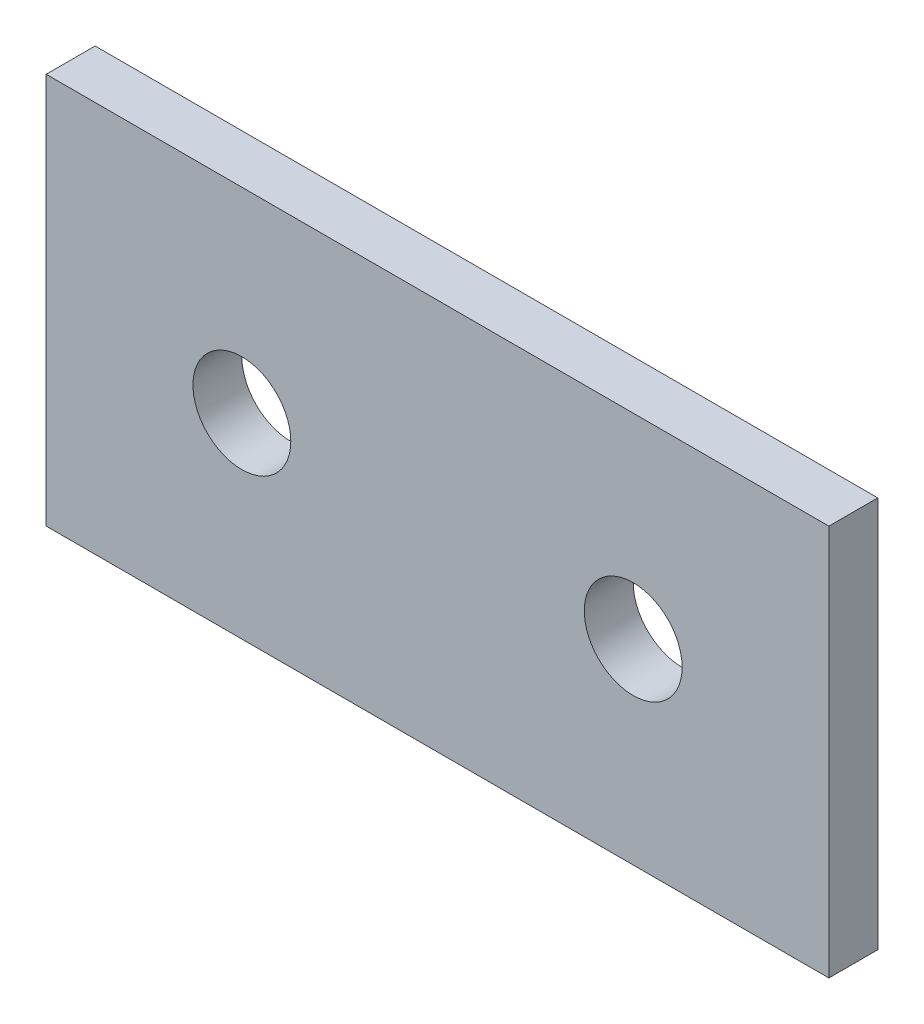
ISO-10303-21;
HEADER;
FILE_DESCRIPTION(('STEP AP214'),'2;1');
FILE_NAME('part.step','',(''),(''),'','','');
FILE_SCHEMA(('AUTOMOTIVE_DESIGN { 1 0 10303 214 1 1 1 1 }'));
ENDSEC;
DATA;
#1=APPLICATION_CONTEXT('core data for automotive mechanical design processes');
#2=APPLICATION_PROTOCOL_DEFINITION('international standard','automotive_design',2000,#1);
#3=PRODUCT_CONTEXT('',#1,'mechanical');
#4=PRODUCT('Part','Part','',(#3));
#5=PRODUCT_RELATED_PRODUCT_CATEGORY('part','',(#4));
#6=PRODUCT_DEFINITION_FORMATION('','',#4);
#7=PRODUCT_DEFINITION_CONTEXT('part definition',#1,'design');
#8=PRODUCT_DEFINITION('design','',#6,#7);
#9=PRODUCT_DEFINITION_SHAPE('','',#8);
#10=(LENGTH_UNIT() NAMED_UNIT(*) SI_UNIT(.MILLI.,.METRE.));
#11=(NAMED_UNIT(*) PLANE_ANGLE_UNIT() SI_UNIT($,.RADIAN.));
#12=(NAMED_UNIT(*) SI_UNIT($,.STERADIAN.) SOLID_ANGLE_UNIT());
#13=UNCERTAINTY_MEASURE_WITH_UNIT(LENGTH_MEASURE(1.E-05),#10,'distance_accuracy_value','');
#14=(GEOMETRIC_REPRESENTATION_CONTEXT(3) GLOBAL_UNCERTAINTY_ASSIGNED_CONTEXT((#13)) GLOBAL_UNIT_ASSIGNED_CONTEXT((#10,
#11,#12)) REPRESENTATION_CONTEXT('',''));
#15=CARTESIAN_POINT('',(0.,0.,0.));
#16=DIRECTION('',(0.,0.,1.));
#17=DIRECTION('',(1.,0.,0.));
#18=AXIS2_PLACEMENT_3D('',#15,#16,#17);
#19=CARTESIAN_POINT('',(0.,0.,3.175));
#20=DIRECTION('',(1.,0.,0.));
#21=DIRECTION('',(0.,1.,0.));
#22=AXIS2_PLACEMENT_3D('',#19,#20,#21);
#23=PLANE('',#22);
#24=DIRECTION('',(0.,-1.,0.));
#25=VECTOR('',#24,1.);
#26=CARTESIAN_POINT('',(0.,0.,0.));
#27=LINE('',#26,#25);
#28=CARTESIAN_POINT('',(0.,25.4,0.));
#29=VERTEX_POINT('',#28);
#30=CARTESIAN_POINT('',(0.,0.,0.));
#31=VERTEX_POINT('',#30);
#32=EDGE_CURVE('E99',#29,#31,#27,.T.);
#33=ORIENTED_EDGE('',*,*,#32,.T.);
#34=DIRECTION('',(0.,0.,-1.));
#35=VECTOR('',#34,1.);
#36=CARTESIAN_POINT('',(0.,0.,3.175));
#37=LINE('',#36,#35);
#38=CARTESIAN_POINT('',(0.,0.,3.175));
#39=VERTEX_POINT('',#38);
#40=EDGE_CURVE('E11',#39,#31,#37,.T.);
#41=ORIENTED_EDGE('',*,*,#40,.F.);
#42=DIRECTION('',(0.,-1.,0.));
#43=VECTOR('',#42,1.);
#44=CARTESIAN_POINT('',(0.,0.,3.175));
#45=LINE('',#44,#43);
#46=CARTESIAN_POINT('',(0.,25.4,3.175));
#47=VERTEX_POINT('',#46);
#48=EDGE_CURVE('E87',#47,#39,#45,.T.);
#49=ORIENTED_EDGE('',*,*,#48,.F.);
#50=DIRECTION('',(0.,0.,-1.));
#51=VECTOR('',#50,1.);
#52=CARTESIAN_POINT('',(0.,25.4,3.175));
#53=LINE('',#52,#51);
#54=EDGE_CURVE('E95',#47,#29,#53,.T.);
#55=ORIENTED_EDGE('',*,*,#54,.T.);
#56=EDGE_LOOP('',(#33,#41,#49,#55));
#57=FACE_BOUND('',#56,.T.);
#58=ADVANCED_FACE('F36',(#57),#23,.F.);
#59=CARTESIAN_POINT('',(0.,0.,3.175));
#60=DIRECTION('',(0.,1.,0.));
#61=DIRECTION('',(0.,0.,1.));
#62=AXIS2_PLACEMENT_3D('',#59,#60,#61);
#63=PLANE('',#62);
#64=DIRECTION('',(1.,0.,0.));
#65=VECTOR('',#64,1.);
#66=CARTESIAN_POINT('',(0.,0.,0.));
#67=LINE('',#66,#65);
#68=CARTESIAN_POINT('',(50.8,0.,0.));
#69=VERTEX_POINT('',#68);
#70=EDGE_CURVE('E91',#31,#69,#67,.T.);
#71=ORIENTED_EDGE('',*,*,#70,.T.);
#72=DIRECTION('',(0.,0.,-1.));
#73=VECTOR('',#72,1.);
#74=CARTESIAN_POINT('',(50.8,0.,3.175));
#75=LINE('',#74,#73);
#76=CARTESIAN_POINT('',(50.8,0.,3.175));
#77=VERTEX_POINT('',#76);
#78=EDGE_CURVE('E44',#77,#69,#75,.T.);
#79=ORIENTED_EDGE('',*,*,#78,.F.);
#80=DIRECTION('',(1.,0.,0.));
#81=VECTOR('',#80,1.);
#82=CARTESIAN_POINT('',(0.,0.,3.175));
#83=LINE('',#82,#81);
#84=EDGE_CURVE('E82',#39,#77,#83,.T.);
#85=ORIENTED_EDGE('',*,*,#84,.F.);
#86=ORIENTED_EDGE('',*,*,#40,.T.);
#87=EDGE_LOOP('',(#71,#79,#85,#86));
#88=FACE_BOUND('',#87,.T.);
#89=ADVANCED_FACE('F90',(#88),#63,.F.);
#90=CARTESIAN_POINT('',(50.8,0.,3.175));
#91=DIRECTION('',(-1.,0.,0.));
#92=DIRECTION('',(0.,-1.,0.));
#93=AXIS2_PLACEMENT_3D('',#90,#91,#92);
#94=PLANE('',#93);
#95=DIRECTION('',(0.,1.,0.));
#96=VECTOR('',#95,1.);
#97=CARTESIAN_POINT('',(50.8,0.,0.));
#98=LINE('',#97,#96);
#99=CARTESIAN_POINT('',(50.8,25.4,0.));
#100=VERTEX_POINT('',#99);
#101=EDGE_CURVE('E69',#69,#100,#98,.T.);
#102=ORIENTED_EDGE('',*,*,#101,.T.);
#103=DIRECTION('',(0.,0.,-1.));
#104=VECTOR('',#103,1.);
#105=CARTESIAN_POINT('',(50.8,25.4,3.175));
#106=LINE('',#105,#104);
#107=CARTESIAN_POINT('',(50.8,25.4,3.175));
#108=VERTEX_POINT('',#107);
#109=EDGE_CURVE('E92',#108,#100,#106,.T.);
#110=ORIENTED_EDGE('',*,*,#109,.F.);
#111=DIRECTION('',(0.,1.,0.));
#112=VECTOR('',#111,1.);
#113=CARTESIAN_POINT('',(50.8,0.,3.175));
#114=LINE('',#113,#112);
#115=EDGE_CURVE('E85',#77,#108,#114,.T.);
#116=ORIENTED_EDGE('',*,*,#115,.F.);
#117=ORIENTED_EDGE('',*,*,#78,.T.);
#118=EDGE_LOOP('',(#102,#110,#116,#117));
#119=FACE_BOUND('',#118,.T.);
#120=ADVANCED_FACE('F93',(#119),#94,.F.);
#121=CARTESIAN_POINT('',(0.,25.4,3.175));
#122=DIRECTION('',(0.,-1.,0.));
#123=DIRECTION('',(0.,0.,-1.));
#124=AXIS2_PLACEMENT_3D('',#121,#122,#123);
#125=PLANE('',#124);
#126=DIRECTION('',(-1.,0.,0.));
#127=VECTOR('',#126,1.);
#128=CARTESIAN_POINT('',(0.,25.4,0.));
#129=LINE('',#128,#127);
#130=EDGE_CURVE('E75',#100,#29,#129,.T.);
#131=ORIENTED_EDGE('',*,*,#130,.T.);
#132=ORIENTED_EDGE('',*,*,#54,.F.);
#133=DIRECTION('',(-1.,0.,0.));
#134=VECTOR('',#133,1.);
#135=CARTESIAN_POINT('',(0.,25.4,3.175));
#136=LINE('',#135,#134);
#137=EDGE_CURVE('E52',#108,#47,#136,.T.);
#138=ORIENTED_EDGE('',*,*,#137,.F.);
#139=ORIENTED_EDGE('',*,*,#109,.T.);
#140=EDGE_LOOP('',(#131,#132,#138,#139));
#141=FACE_BOUND('',#140,.T.);
#142=ADVANCED_FACE('F107',(#141),#125,.F.);
#143=CARTESIAN_POINT('',(0.,0.,3.175));
#144=DIRECTION('',(0.,0.,-1.));
#145=DIRECTION('',(-1.,0.,0.));
#146=AXIS2_PLACEMENT_3D('',#143,#144,#145);
#147=PLANE('',#146);
#148=CARTESIAN_POINT('',(12.7,12.7,3.175));
#149=DIRECTION('',(0.,0.,1.));
#150=DIRECTION('',(1.,0.,0.));
#151=AXIS2_PLACEMENT_3D('',#148,#149,#150);
#152=CIRCLE('',#151,3.175);
#153=CARTESIAN_POINT('',(15.875,12.7,3.175));
#154=VERTEX_POINT('',#153);
#155=EDGE_CURVE('E116',#154,#154,#152,.T.);
#156=ORIENTED_EDGE('',*,*,#155,.F.);
#157=EDGE_LOOP('',(#156));
#158=FACE_BOUND('',#157,.T.);
#159=CARTESIAN_POINT('',(38.1,12.7,3.175));
#160=DIRECTION('',(0.,0.,1.));
#161=DIRECTION('',(1.,0.,0.));
#162=AXIS2_PLACEMENT_3D('',#159,#160,#161);
#163=CIRCLE('',#162,3.175);
#164=CARTESIAN_POINT('',(41.275,12.7,3.175));
#165=VERTEX_POINT('',#164);
#166=EDGE_CURVE('E113',#165,#165,#163,.T.);
#167=ORIENTED_EDGE('',*,*,#166,.F.);
#168=EDGE_LOOP('',(#167));
#169=FACE_BOUND('',#168,.T.);
#170=ORIENTED_EDGE('',*,*,#48,.T.);
#171=ORIENTED_EDGE('',*,*,#84,.T.);
#172=ORIENTED_EDGE('',*,*,#115,.T.);
#173=ORIENTED_EDGE('',*,*,#137,.T.);
#174=EDGE_LOOP('',(#170,#171,#172,#173));
#175=FACE_BOUND('',#174,.T.);
#176=ADVANCED_FACE('F83',(#158,#169,#175),#147,.F.);
#177=CARTESIAN_POINT('',(0.,0.,0.));
#178=DIRECTION('',(0.,0.,-1.));
#179=DIRECTION('',(-1.,0.,0.));
#180=AXIS2_PLACEMENT_3D('',#177,#178,#179);
#181=PLANE('',#180);
#182=CARTESIAN_POINT('',(12.7,12.7,0.));
#183=DIRECTION('',(0.,0.,-1.));
#184=DIRECTION('',(-1.,0.,0.));
#185=AXIS2_PLACEMENT_3D('',#182,#183,#184);
#186=CIRCLE('',#185,3.175);
#187=CARTESIAN_POINT('',(9.525,12.7,0.));
#188=VERTEX_POINT('',#187);
#189=EDGE_CURVE('E102',#188,#188,#186,.F.);
#190=ORIENTED_EDGE('',*,*,#189,.T.);
#191=EDGE_LOOP('',(#190));
#192=FACE_BOUND('',#191,.T.);
#193=CARTESIAN_POINT('',(38.1,12.7,0.));
#194=DIRECTION('',(0.,0.,-1.));
#195=DIRECTION('',(-1.,0.,0.));
#196=AXIS2_PLACEMENT_3D('',#193,#194,#195);
#197=CIRCLE('',#196,3.175);
#198=CARTESIAN_POINT('',(34.925,12.7,0.));
#199=VERTEX_POINT('',#198);
#200=EDGE_CURVE('E117',#199,#199,#197,.F.);
#201=ORIENTED_EDGE('',*,*,#200,.T.);
#202=EDGE_LOOP('',(#201));
#203=FACE_BOUND('',#202,.T.);
#204=ORIENTED_EDGE('',*,*,#32,.F.);
#205=ORIENTED_EDGE('',*,*,#130,.F.);
#206=ORIENTED_EDGE('',*,*,#101,.F.);
#207=ORIENTED_EDGE('',*,*,#70,.F.);
#208=EDGE_LOOP('',(#204,#205,#206,#207));
#209=FACE_BOUND('',#208,.T.);
#210=ADVANCED_FACE('F110',(#192,#203,#209),#181,.T.);
#211=CARTESIAN_POINT('',(38.1,12.7,-8.98025612106907));
#212=DIRECTION('',(0.,0.,1.));
#213=DIRECTION('',(1.,0.,0.));
#214=AXIS2_PLACEMENT_3D('',#211,#212,#213);
#215=CYLINDRICAL_SURFACE('',#214,3.175);
#216=ORIENTED_EDGE('',*,*,#166,.T.);
#217=EDGE_LOOP('',(#216));
#218=FACE_BOUND('',#217,.T.);
#219=ORIENTED_EDGE('',*,*,#200,.F.);
#220=EDGE_LOOP('',(#219));
#221=FACE_BOUND('',#220,.T.);
#222=ADVANCED_FACE('F133',(#218,#221),#215,.F.);
#223=CARTESIAN_POINT('',(12.7,12.7,-8.98025612106907));
#224=DIRECTION('',(0.,0.,1.));
#225=DIRECTION('',(1.,0.,0.));
#226=AXIS2_PLACEMENT_3D('',#223,#224,#225);
#227=CYLINDRICAL_SURFACE('',#226,3.175);
#228=ORIENTED_EDGE('',*,*,#155,.T.);
#229=EDGE_LOOP('',(#228));
#230=FACE_BOUND('',#229,.T.);
#231=ORIENTED_EDGE('',*,*,#189,.F.);
#232=EDGE_LOOP('',(#231));
#233=FACE_BOUND('',#232,.T.);
#234=ADVANCED_FACE('F125',(#230,#233),#227,.F.);
#235=CLOSED_SHELL('',(#58,#89,#120,#142,#176,#210,#222,#234));
#236=MANIFOLD_SOLID_BREP('B2',#235);
#237=ADVANCED_BREP_SHAPE_REPRESENTATION('',(#18,#236),#14);
#238=SHAPE_DEFINITION_REPRESENTATION(#9,#237);
ENDSEC;
END-ISO-10303-21;
